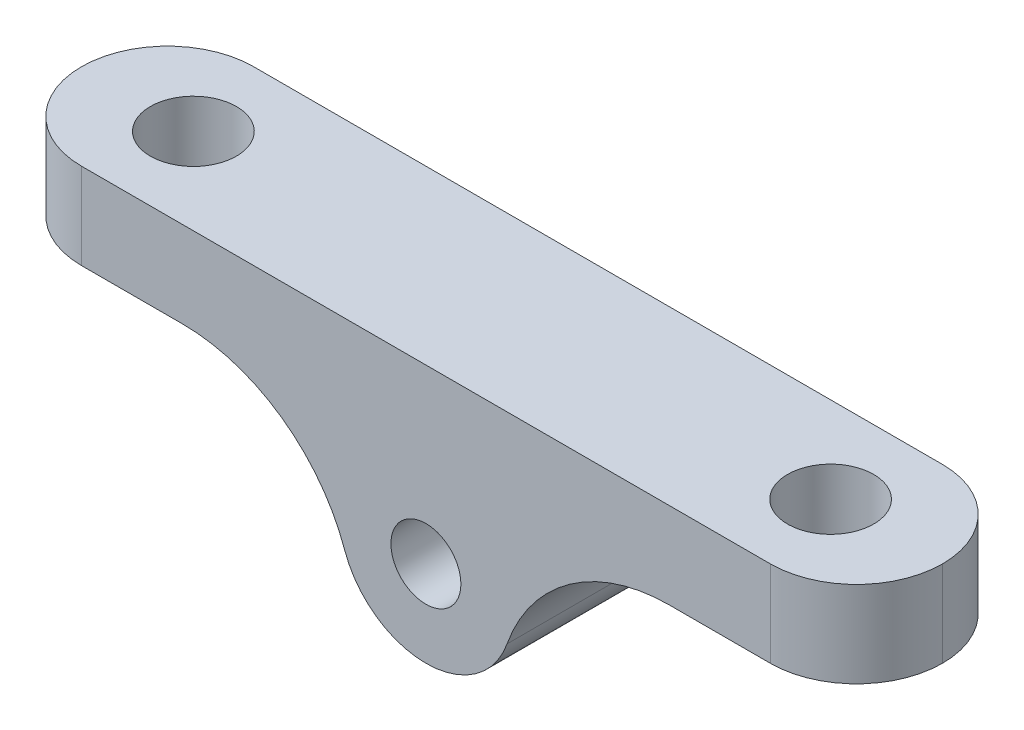
ISO-10303-21;
HEADER;
FILE_DESCRIPTION(('STEP AP214'),'2;1');
FILE_NAME('part.step','',(''),(''),'','','');
FILE_SCHEMA(('AUTOMOTIVE_DESIGN { 1 0 10303 214 1 1 1 1 }'));
ENDSEC;
DATA;
#1=APPLICATION_CONTEXT('core data for automotive mechanical design processes');
#2=APPLICATION_PROTOCOL_DEFINITION('international standard','automotive_design',2000,#1);
#3=PRODUCT_CONTEXT('',#1,'mechanical');
#4=PRODUCT('Part','Part','',(#3));
#5=PRODUCT_RELATED_PRODUCT_CATEGORY('part','',(#4));
#6=PRODUCT_DEFINITION_FORMATION('','',#4);
#7=PRODUCT_DEFINITION_CONTEXT('part definition',#1,'design');
#8=PRODUCT_DEFINITION('design','',#6,#7);
#9=PRODUCT_DEFINITION_SHAPE('','',#8);
#10=(LENGTH_UNIT() NAMED_UNIT(*) SI_UNIT(.MILLI.,.METRE.));
#11=(NAMED_UNIT(*) PLANE_ANGLE_UNIT() SI_UNIT($,.RADIAN.));
#12=(NAMED_UNIT(*) SI_UNIT($,.STERADIAN.) SOLID_ANGLE_UNIT());
#13=UNCERTAINTY_MEASURE_WITH_UNIT(LENGTH_MEASURE(1.E-05),#10,'distance_accuracy_value','');
#14=(GEOMETRIC_REPRESENTATION_CONTEXT(3) GLOBAL_UNCERTAINTY_ASSIGNED_CONTEXT((#13)) GLOBAL_UNIT_ASSIGNED_CONTEXT((#10,
#11,#12)) REPRESENTATION_CONTEXT('',''));
#15=CARTESIAN_POINT('',(0.,0.,0.));
#16=DIRECTION('',(0.,0.,1.));
#17=DIRECTION('',(1.,0.,0.));
#18=AXIS2_PLACEMENT_3D('',#15,#16,#17);
#19=CARTESIAN_POINT('',(63.5,-6.34999999999999,12.7));
#20=DIRECTION('',(0.,-1.,0.));
#21=DIRECTION('',(1.,0.,0.));
#22=AXIS2_PLACEMENT_3D('',#19,#20,#21);
#23=PLANE('',#22);
#24=CARTESIAN_POINT('',(8.25499999999998,-6.35,6.35));
#25=DIRECTION('',(0.,-1.,0.));
#26=DIRECTION('',(1.,0.,0.));
#27=AXIS2_PLACEMENT_3D('',#24,#25,#26);
#28=CIRCLE('',#27,3.175);
#29=CARTESIAN_POINT('',(11.43,-6.35,6.35));
#30=VERTEX_POINT('',#29);
#31=EDGE_CURVE('E230',#30,#30,#28,.T.);
#32=ORIENTED_EDGE('',*,*,#31,.F.);
#33=EDGE_LOOP('',(#32));
#34=FACE_BOUND('',#33,.T.);
#35=DIRECTION('',(-1.,0.,0.));
#36=VECTOR('',#35,1.);
#37=CARTESIAN_POINT('',(63.5,-6.34999999999999,0.));
#38=LINE('',#37,#36);
#39=CARTESIAN_POINT('',(13.7894877578617,-6.35,0.));
#40=VERTEX_POINT('',#39);
#41=CARTESIAN_POINT('',(6.35,-6.35,0.));
#42=VERTEX_POINT('',#41);
#43=EDGE_CURVE('E145',#40,#42,#38,.T.);
#44=ORIENTED_EDGE('',*,*,#43,.F.);
#45=DIRECTION('',(0.,0.,-1.));
#46=VECTOR('',#45,1.);
#47=CARTESIAN_POINT('',(13.7894877578617,-6.35,12.7));
#48=LINE('',#47,#46);
#49=CARTESIAN_POINT('',(13.7894877578617,-6.35,12.7));
#50=VERTEX_POINT('',#49);
#51=EDGE_CURVE('E201',#40,#50,#48,.F.);
#52=ORIENTED_EDGE('',*,*,#51,.T.);
#53=DIRECTION('',(-1.,0.,0.));
#54=VECTOR('',#53,1.);
#55=CARTESIAN_POINT('',(63.5,-6.34999999999999,12.7));
#56=LINE('',#55,#54);
#57=CARTESIAN_POINT('',(6.35,-6.35,12.7));
#58=VERTEX_POINT('',#57);
#59=EDGE_CURVE('E218',#50,#58,#56,.T.);
#60=ORIENTED_EDGE('',*,*,#59,.T.);
#61=CARTESIAN_POINT('',(6.35,-6.35,6.35));
#62=DIRECTION('',(0.,-1.,0.));
#63=DIRECTION('',(1.,0.,0.));
#64=AXIS2_PLACEMENT_3D('',#61,#62,#63);
#65=CIRCLE('',#64,6.35);
#66=CARTESIAN_POINT('',(0.,-6.35,6.35));
#67=VERTEX_POINT('',#66);
#68=EDGE_CURVE('E160',#58,#67,#65,.T.);
#69=ORIENTED_EDGE('',*,*,#68,.T.);
#70=CARTESIAN_POINT('',(6.35,-6.35,6.35));
#71=DIRECTION('',(0.,-1.,0.));
#72=DIRECTION('',(1.,0.,0.));
#73=AXIS2_PLACEMENT_3D('',#70,#71,#72);
#74=CIRCLE('',#73,6.35);
#75=EDGE_CURVE('E153',#67,#42,#74,.T.);
#76=ORIENTED_EDGE('',*,*,#75,.T.);
#77=EDGE_LOOP('',(#44,#52,#60,#69,#76));
#78=FACE_BOUND('',#77,.T.);
#79=ADVANCED_FACE('F43',(#34,#78),#23,.T.);
#80=CARTESIAN_POINT('',(0.,0.,12.7));
#81=DIRECTION('',(0.,1.,0.));
#82=DIRECTION('',(-1.,0.,0.));
#83=AXIS2_PLACEMENT_3D('',#80,#81,#82);
#84=PLANE('',#83);
#85=CARTESIAN_POINT('',(8.255,0.,6.35));
#86=DIRECTION('',(0.,1.,0.));
#87=DIRECTION('',(-1.,0.,0.));
#88=AXIS2_PLACEMENT_3D('',#85,#86,#87);
#89=CIRCLE('',#88,3.175);
#90=CARTESIAN_POINT('',(5.08,0.,6.35));
#91=VERTEX_POINT('',#90);
#92=EDGE_CURVE('E243',#91,#91,#89,.T.);
#93=ORIENTED_EDGE('',*,*,#92,.F.);
#94=EDGE_LOOP('',(#93));
#95=FACE_BOUND('',#94,.T.);
#96=CARTESIAN_POINT('',(55.245,-1.92081199430886E-13,6.35));
#97=DIRECTION('',(0.,1.,0.));
#98=DIRECTION('',(-1.,0.,0.));
#99=AXIS2_PLACEMENT_3D('',#96,#97,#98);
#100=CIRCLE('',#99,3.175);
#101=CARTESIAN_POINT('',(52.07,-1.81042050038307E-13,6.35));
#102=VERTEX_POINT('',#101);
#103=EDGE_CURVE('E187',#102,#102,#100,.T.);
#104=ORIENTED_EDGE('',*,*,#103,.F.);
#105=EDGE_LOOP('',(#104));
#106=FACE_BOUND('',#105,.T.);
#107=DIRECTION('',(1.,0.,0.));
#108=VECTOR('',#107,1.);
#109=CARTESIAN_POINT('',(0.,0.,12.7));
#110=LINE('',#109,#108);
#111=CARTESIAN_POINT('',(6.35,0.,12.7));
#112=VERTEX_POINT('',#111);
#113=CARTESIAN_POINT('',(57.15,0.,12.7));
#114=VERTEX_POINT('',#113);
#115=EDGE_CURVE('E237',#112,#114,#110,.T.);
#116=ORIENTED_EDGE('',*,*,#115,.T.);
#117=CARTESIAN_POINT('',(57.15,0.,6.35));
#118=DIRECTION('',(0.,1.,0.));
#119=DIRECTION('',(-1.,0.,0.));
#120=AXIS2_PLACEMENT_3D('',#117,#118,#119);
#121=CIRCLE('',#120,6.35);
#122=CARTESIAN_POINT('',(63.5,0.,6.35));
#123=VERTEX_POINT('',#122);
#124=EDGE_CURVE('E180',#114,#123,#121,.T.);
#125=ORIENTED_EDGE('',*,*,#124,.T.);
#126=CARTESIAN_POINT('',(57.15,0.,6.35));
#127=DIRECTION('',(0.,1.,0.));
#128=DIRECTION('',(-1.,0.,0.));
#129=AXIS2_PLACEMENT_3D('',#126,#127,#128);
#130=CIRCLE('',#129,6.35);
#131=CARTESIAN_POINT('',(57.15,0.,0.));
#132=VERTEX_POINT('',#131);
#133=EDGE_CURVE('E177',#123,#132,#130,.T.);
#134=ORIENTED_EDGE('',*,*,#133,.T.);
#135=DIRECTION('',(1.,0.,0.));
#136=VECTOR('',#135,1.);
#137=CARTESIAN_POINT('',(0.,0.,0.));
#138=LINE('',#137,#136);
#139=CARTESIAN_POINT('',(6.35,0.,0.));
#140=VERTEX_POINT('',#139);
#141=EDGE_CURVE('E128',#140,#132,#138,.T.);
#142=ORIENTED_EDGE('',*,*,#141,.F.);
#143=CARTESIAN_POINT('',(6.35,0.,6.35));
#144=DIRECTION('',(0.,1.,0.));
#145=DIRECTION('',(-1.,0.,0.));
#146=AXIS2_PLACEMENT_3D('',#143,#144,#145);
#147=CIRCLE('',#146,6.35);
#148=CARTESIAN_POINT('',(0.,0.,6.35));
#149=VERTEX_POINT('',#148);
#150=EDGE_CURVE('E174',#140,#149,#147,.T.);
#151=ORIENTED_EDGE('',*,*,#150,.T.);
#152=CARTESIAN_POINT('',(6.35,0.,6.35));
#153=DIRECTION('',(0.,1.,0.));
#154=DIRECTION('',(-1.,0.,0.));
#155=AXIS2_PLACEMENT_3D('',#152,#153,#154);
#156=CIRCLE('',#155,6.35);
#157=EDGE_CURVE('E171',#149,#112,#156,.T.);
#158=ORIENTED_EDGE('',*,*,#157,.T.);
#159=EDGE_LOOP('',(#116,#125,#134,#142,#151,#158));
#160=FACE_BOUND('',#159,.T.);
#161=ADVANCED_FACE('F274',(#95,#106,#160),#84,.T.);
#162=CARTESIAN_POINT('',(57.15,-6.34999999999999,12.7));
#163=VERTEX_POINT('',#162);
#164=CARTESIAN_POINT('',(49.7105122421383,-6.34999999999999,12.7));
#165=VERTEX_POINT('',#164);
#166=EDGE_CURVE('E249',#163,#165,#56,.T.);
#167=ORIENTED_EDGE('',*,*,#166,.T.);
#168=DIRECTION('',(0.,0.,-1.));
#169=VECTOR('',#168,1.);
#170=CARTESIAN_POINT('',(49.7105122421383,-6.34999999999999,0.));
#171=LINE('',#170,#169);
#172=CARTESIAN_POINT('',(49.7105122421383,-6.34999999999999,0.));
#173=VERTEX_POINT('',#172);
#174=EDGE_CURVE('E143',#165,#173,#171,.T.);
#175=ORIENTED_EDGE('',*,*,#174,.T.);
#176=CARTESIAN_POINT('',(57.15,-6.34999999999999,0.));
#177=VERTEX_POINT('',#176);
#178=EDGE_CURVE('E124',#177,#173,#38,.T.);
#179=ORIENTED_EDGE('',*,*,#178,.F.);
#180=CARTESIAN_POINT('',(57.15,-6.34999999999999,6.35));
#181=DIRECTION('',(0.,-1.,0.));
#182=DIRECTION('',(1.,0.,0.));
#183=AXIS2_PLACEMENT_3D('',#180,#181,#182);
#184=CIRCLE('',#183,6.35);
#185=CARTESIAN_POINT('',(63.5,-6.34999999999999,6.35));
#186=VERTEX_POINT('',#185);
#187=EDGE_CURVE('E140',#177,#186,#184,.T.);
#188=ORIENTED_EDGE('',*,*,#187,.T.);
#189=CARTESIAN_POINT('',(57.15,-6.34999999999999,6.35));
#190=DIRECTION('',(0.,-1.,0.));
#191=DIRECTION('',(1.,0.,0.));
#192=AXIS2_PLACEMENT_3D('',#189,#190,#191);
#193=CIRCLE('',#192,6.35);
#194=EDGE_CURVE('E152',#186,#163,#193,.T.);
#195=ORIENTED_EDGE('',*,*,#194,.T.);
#196=EDGE_LOOP('',(#167,#175,#179,#188,#195));
#197=FACE_BOUND('',#196,.T.);
#198=CARTESIAN_POINT('',(55.245,-6.34999999999999,6.35));
#199=DIRECTION('',(0.,-1.,0.));
#200=DIRECTION('',(1.,0.,0.));
#201=AXIS2_PLACEMENT_3D('',#198,#199,#200);
#202=CIRCLE('',#201,3.175);
#203=CARTESIAN_POINT('',(58.42,-6.34999999999999,6.35));
#204=VERTEX_POINT('',#203);
#205=EDGE_CURVE('E233',#204,#204,#202,.T.);
#206=ORIENTED_EDGE('',*,*,#205,.F.);
#207=EDGE_LOOP('',(#206));
#208=FACE_BOUND('',#207,.T.);
#209=ADVANCED_FACE('F138',(#197,#208),#23,.T.);
#210=CARTESIAN_POINT('',(0.,0.,12.7));
#211=DIRECTION('',(0.,0.,-1.));
#212=DIRECTION('',(-1.,0.,0.));
#213=AXIS2_PLACEMENT_3D('',#210,#211,#212);
#214=PLANE('',#213);
#215=ORIENTED_EDGE('',*,*,#166,.F.);
#216=DIRECTION('',(0.,-1.,0.));
#217=VECTOR('',#216,1.);
#218=CARTESIAN_POINT('',(57.15,0.,12.7));
#219=LINE('',#218,#217);
#220=EDGE_CURVE('E167',#163,#114,#219,.F.);
#221=ORIENTED_EDGE('',*,*,#220,.T.);
#222=ORIENTED_EDGE('',*,*,#115,.F.);
#223=DIRECTION('',(0.,-1.,0.));
#224=VECTOR('',#223,1.);
#225=CARTESIAN_POINT('',(6.35,0.,12.7));
#226=LINE('',#225,#224);
#227=EDGE_CURVE('E157',#112,#58,#226,.T.);
#228=ORIENTED_EDGE('',*,*,#227,.T.);
#229=ORIENTED_EDGE('',*,*,#59,.F.);
#230=CARTESIAN_POINT('',(13.7894877578617,-19.05,12.7));
#231=DIRECTION('',(0.,0.,-1.));
#232=DIRECTION('',(-1.,0.,0.));
#233=AXIS2_PLACEMENT_3D('',#230,#231,#232);
#234=CIRCLE('',#233,12.7);
#235=CARTESIAN_POINT('',(25.7631625859539,-14.8166666666667,12.7));
#236=VERTEX_POINT('',#235);
#237=EDGE_CURVE('E52',#50,#236,#234,.T.);
#238=ORIENTED_EDGE('',*,*,#237,.T.);
#239=CARTESIAN_POINT('',(31.75,-12.7,12.7));
#240=DIRECTION('',(0.,0.,1.));
#241=DIRECTION('',(1.,0.,0.));
#242=AXIS2_PLACEMENT_3D('',#239,#240,#241);
#243=CIRCLE('',#242,6.35);
#244=CARTESIAN_POINT('',(37.7368374140461,-14.8166666666667,12.7));
#245=VERTEX_POINT('',#244);
#246=EDGE_CURVE('E217',#236,#245,#243,.T.);
#247=ORIENTED_EDGE('',*,*,#246,.T.);
#248=CARTESIAN_POINT('',(49.7105122421383,-19.05,12.7));
#249=DIRECTION('',(0.,0.,-1.));
#250=DIRECTION('',(-1.,0.,0.));
#251=AXIS2_PLACEMENT_3D('',#248,#249,#250);
#252=CIRCLE('',#251,12.7);
#253=EDGE_CURVE('E204',#245,#165,#252,.T.);
#254=ORIENTED_EDGE('',*,*,#253,.T.);
#255=EDGE_LOOP('',(#215,#221,#222,#228,#229,#238,#247,#254));
#256=FACE_BOUND('',#255,.T.);
#257=CARTESIAN_POINT('',(31.75,-12.7,12.7));
#258=DIRECTION('',(0.,0.,1.));
#259=DIRECTION('',(1.,0.,0.));
#260=AXIS2_PLACEMENT_3D('',#257,#258,#259);
#261=CIRCLE('',#260,2.5796875);
#262=CARTESIAN_POINT('',(34.3296875,-12.7,12.7));
#263=VERTEX_POINT('',#262);
#264=EDGE_CURVE('E224',#263,#263,#261,.T.);
#265=ORIENTED_EDGE('',*,*,#264,.F.);
#266=EDGE_LOOP('',(#265));
#267=FACE_BOUND('',#266,.T.);
#268=ADVANCED_FACE('F215',(#256,#267),#214,.F.);
#269=CARTESIAN_POINT('',(0.,0.,0.));
#270=DIRECTION('',(0.,0.,-1.));
#271=DIRECTION('',(-1.,0.,0.));
#272=AXIS2_PLACEMENT_3D('',#269,#270,#271);
#273=PLANE('',#272);
#274=ORIENTED_EDGE('',*,*,#141,.T.);
#275=DIRECTION('',(0.,-1.,0.));
#276=VECTOR('',#275,1.);
#277=CARTESIAN_POINT('',(57.15,0.,0.));
#278=LINE('',#277,#276);
#279=EDGE_CURVE('E120',#132,#177,#278,.T.);
#280=ORIENTED_EDGE('',*,*,#279,.T.);
#281=ORIENTED_EDGE('',*,*,#178,.T.);
#282=CARTESIAN_POINT('',(49.7105122421383,-19.05,0.));
#283=DIRECTION('',(0.,0.,-1.));
#284=DIRECTION('',(-1.,0.,0.));
#285=AXIS2_PLACEMENT_3D('',#282,#283,#284);
#286=CIRCLE('',#285,12.7);
#287=CARTESIAN_POINT('',(37.7368374140461,-14.8166666666667,0.));
#288=VERTEX_POINT('',#287);
#289=EDGE_CURVE('E207',#173,#288,#286,.F.);
#290=ORIENTED_EDGE('',*,*,#289,.T.);
#291=CARTESIAN_POINT('',(31.75,-12.7,0.));
#292=DIRECTION('',(0.,0.,1.));
#293=DIRECTION('',(1.,0.,0.));
#294=AXIS2_PLACEMENT_3D('',#291,#292,#293);
#295=CIRCLE('',#294,6.35);
#296=CARTESIAN_POINT('',(25.7631625859539,-14.8166666666667,0.));
#297=VERTEX_POINT('',#296);
#298=EDGE_CURVE('E263',#297,#288,#295,.T.);
#299=ORIENTED_EDGE('',*,*,#298,.F.);
#300=CARTESIAN_POINT('',(13.7894877578617,-19.05,0.));
#301=DIRECTION('',(0.,0.,-1.));
#302=DIRECTION('',(-1.,0.,0.));
#303=AXIS2_PLACEMENT_3D('',#300,#301,#302);
#304=CIRCLE('',#303,12.7);
#305=EDGE_CURVE('E11',#297,#40,#304,.F.);
#306=ORIENTED_EDGE('',*,*,#305,.T.);
#307=ORIENTED_EDGE('',*,*,#43,.T.);
#308=DIRECTION('',(0.,-1.,0.));
#309=VECTOR('',#308,1.);
#310=CARTESIAN_POINT('',(6.35,0.,0.));
#311=LINE('',#310,#309);
#312=EDGE_CURVE('E134',#42,#140,#311,.F.);
#313=ORIENTED_EDGE('',*,*,#312,.T.);
#314=EDGE_LOOP('',(#274,#280,#281,#290,#299,#306,#307,#313));
#315=FACE_BOUND('',#314,.T.);
#316=CARTESIAN_POINT('',(31.75,-12.7,0.));
#317=DIRECTION('',(0.,0.,1.));
#318=DIRECTION('',(1.,0.,0.));
#319=AXIS2_PLACEMENT_3D('',#316,#317,#318);
#320=CIRCLE('',#319,2.5796875);
#321=CARTESIAN_POINT('',(34.3296875,-12.7,0.));
#322=VERTEX_POINT('',#321);
#323=EDGE_CURVE('E192',#322,#322,#320,.T.);
#324=ORIENTED_EDGE('',*,*,#323,.T.);
#325=EDGE_LOOP('',(#324));
#326=FACE_BOUND('',#325,.T.);
#327=ADVANCED_FACE('F122',(#315,#326),#273,.T.);
#328=CARTESIAN_POINT('',(55.2449999999999,-26.1620000000002,6.35));
#329=DIRECTION('',(0.,1.,0.));
#330=DIRECTION('',(-1.,0.,0.));
#331=AXIS2_PLACEMENT_3D('',#328,#329,#330);
#332=CYLINDRICAL_SURFACE('',#331,3.175);
#333=ORIENTED_EDGE('',*,*,#205,.T.);
#334=EDGE_LOOP('',(#333));
#335=FACE_BOUND('',#334,.T.);
#336=ORIENTED_EDGE('',*,*,#103,.T.);
#337=EDGE_LOOP('',(#336));
#338=FACE_BOUND('',#337,.T.);
#339=ADVANCED_FACE('F309',(#335,#338),#332,.F.);
#340=CARTESIAN_POINT('',(8.25499999999991,-26.162,6.35));
#341=DIRECTION('',(0.,1.,0.));
#342=DIRECTION('',(-1.,0.,0.));
#343=AXIS2_PLACEMENT_3D('',#340,#341,#342);
#344=CYLINDRICAL_SURFACE('',#343,3.175);
#345=ORIENTED_EDGE('',*,*,#31,.T.);
#346=EDGE_LOOP('',(#345));
#347=FACE_BOUND('',#346,.T.);
#348=ORIENTED_EDGE('',*,*,#92,.T.);
#349=EDGE_LOOP('',(#348));
#350=FACE_BOUND('',#349,.T.);
#351=ADVANCED_FACE('F314',(#347,#350),#344,.F.);
#352=CARTESIAN_POINT('',(57.15,0.,6.35));
#353=DIRECTION('',(0.,-1.,0.));
#354=DIRECTION('',(0.,0.,-1.));
#355=AXIS2_PLACEMENT_3D('',#352,#353,#354);
#356=CYLINDRICAL_SURFACE('',#355,6.35);
#357=ORIENTED_EDGE('',*,*,#279,.F.);
#358=ORIENTED_EDGE('',*,*,#133,.F.);
#359=DIRECTION('',(0.,-1.,0.));
#360=VECTOR('',#359,1.);
#361=CARTESIAN_POINT('',(63.5,0.,6.35));
#362=LINE('',#361,#360);
#363=EDGE_CURVE('E149',#186,#123,#362,.F.);
#364=ORIENTED_EDGE('',*,*,#363,.F.);
#365=ORIENTED_EDGE('',*,*,#187,.F.);
#366=EDGE_LOOP('',(#357,#358,#364,#365));
#367=FACE_BOUND('',#366,.T.);
#368=ADVANCED_FACE('F147',(#367),#356,.T.);
#369=CARTESIAN_POINT('',(57.15,0.,6.35));
#370=DIRECTION('',(0.,1.,0.));
#371=DIRECTION('',(0.,0.,1.));
#372=AXIS2_PLACEMENT_3D('',#369,#370,#371);
#373=CYLINDRICAL_SURFACE('',#372,6.35);
#374=ORIENTED_EDGE('',*,*,#124,.F.);
#375=ORIENTED_EDGE('',*,*,#220,.F.);
#376=ORIENTED_EDGE('',*,*,#194,.F.);
#377=ORIENTED_EDGE('',*,*,#363,.T.);
#378=EDGE_LOOP('',(#374,#375,#376,#377));
#379=FACE_BOUND('',#378,.T.);
#380=ADVANCED_FACE('F273',(#379),#373,.T.);
#381=CARTESIAN_POINT('',(6.35,0.,6.35));
#382=DIRECTION('',(0.,-1.,0.));
#383=DIRECTION('',(1.,0.,0.));
#384=AXIS2_PLACEMENT_3D('',#381,#382,#383);
#385=CYLINDRICAL_SURFACE('',#384,6.35);
#386=ORIENTED_EDGE('',*,*,#227,.F.);
#387=ORIENTED_EDGE('',*,*,#157,.F.);
#388=DIRECTION('',(0.,-1.,0.));
#389=VECTOR('',#388,1.);
#390=CARTESIAN_POINT('',(0.,0.,6.35));
#391=LINE('',#390,#389);
#392=EDGE_CURVE('E188',#67,#149,#391,.F.);
#393=ORIENTED_EDGE('',*,*,#392,.F.);
#394=ORIENTED_EDGE('',*,*,#68,.F.);
#395=EDGE_LOOP('',(#386,#387,#393,#394));
#396=FACE_BOUND('',#395,.T.);
#397=ADVANCED_FACE('F279',(#396),#385,.T.);
#398=CARTESIAN_POINT('',(6.35,0.,6.35));
#399=DIRECTION('',(0.,1.,0.));
#400=DIRECTION('',(-1.,0.,0.));
#401=AXIS2_PLACEMENT_3D('',#398,#399,#400);
#402=CYLINDRICAL_SURFACE('',#401,6.35);
#403=ORIENTED_EDGE('',*,*,#150,.F.);
#404=ORIENTED_EDGE('',*,*,#312,.F.);
#405=ORIENTED_EDGE('',*,*,#75,.F.);
#406=ORIENTED_EDGE('',*,*,#392,.T.);
#407=EDGE_LOOP('',(#403,#404,#405,#406));
#408=FACE_BOUND('',#407,.T.);
#409=ADVANCED_FACE('F280',(#408),#402,.T.);
#410=CARTESIAN_POINT('',(31.75,-12.7,0.));
#411=DIRECTION('',(0.,0.,1.));
#412=DIRECTION('',(1.,0.,0.));
#413=AXIS2_PLACEMENT_3D('',#410,#411,#412);
#414=CYLINDRICAL_SURFACE('',#413,6.35);
#415=ORIENTED_EDGE('',*,*,#298,.T.);
#416=DIRECTION('',(0.,0.,1.));
#417=VECTOR('',#416,1.);
#418=CARTESIAN_POINT('',(37.7368374140461,-14.8166666666667,0.));
#419=LINE('',#418,#417);
#420=EDGE_CURVE('E195',#288,#245,#419,.T.);
#421=ORIENTED_EDGE('',*,*,#420,.T.);
#422=ORIENTED_EDGE('',*,*,#246,.F.);
#423=DIRECTION('',(0.,0.,1.));
#424=VECTOR('',#423,1.);
#425=CARTESIAN_POINT('',(25.7631625859539,-14.8166666666667,0.));
#426=LINE('',#425,#424);
#427=EDGE_CURVE('E133',#236,#297,#426,.F.);
#428=ORIENTED_EDGE('',*,*,#427,.T.);
#429=EDGE_LOOP('',(#415,#421,#422,#428));
#430=FACE_BOUND('',#429,.T.);
#431=ADVANCED_FACE('F221',(#430),#414,.T.);
#432=CARTESIAN_POINT('',(31.75,-12.7,0.));
#433=DIRECTION('',(0.,0.,1.));
#434=DIRECTION('',(1.,0.,0.));
#435=AXIS2_PLACEMENT_3D('',#432,#433,#434);
#436=CYLINDRICAL_SURFACE('',#435,2.5796875);
#437=ORIENTED_EDGE('',*,*,#323,.F.);
#438=EDGE_LOOP('',(#437));
#439=FACE_BOUND('',#438,.T.);
#440=ORIENTED_EDGE('',*,*,#264,.T.);
#441=EDGE_LOOP('',(#440));
#442=FACE_BOUND('',#441,.T.);
#443=ADVANCED_FACE('F287',(#439,#442),#436,.F.);
#444=CARTESIAN_POINT('',(49.7105122421383,-19.05,0.));
#445=DIRECTION('',(0.,0.,1.));
#446=DIRECTION('',(1.,0.,0.));
#447=AXIS2_PLACEMENT_3D('',#444,#445,#446);
#448=CYLINDRICAL_SURFACE('',#447,12.7);
#449=ORIENTED_EDGE('',*,*,#289,.F.);
#450=ORIENTED_EDGE('',*,*,#174,.F.);
#451=ORIENTED_EDGE('',*,*,#253,.F.);
#452=ORIENTED_EDGE('',*,*,#420,.F.);
#453=EDGE_LOOP('',(#449,#450,#451,#452));
#454=FACE_BOUND('',#453,.T.);
#455=ADVANCED_FACE('F270',(#454),#448,.F.);
#456=CARTESIAN_POINT('',(13.7894877578617,-19.05,0.));
#457=DIRECTION('',(0.,0.,1.));
#458=DIRECTION('',(1.,0.,0.));
#459=AXIS2_PLACEMENT_3D('',#456,#457,#458);
#460=CYLINDRICAL_SURFACE('',#459,12.7);
#461=ORIENTED_EDGE('',*,*,#305,.F.);
#462=ORIENTED_EDGE('',*,*,#427,.F.);
#463=ORIENTED_EDGE('',*,*,#237,.F.);
#464=ORIENTED_EDGE('',*,*,#51,.F.);
#465=EDGE_LOOP('',(#461,#462,#463,#464));
#466=FACE_BOUND('',#465,.T.);
#467=ADVANCED_FACE('F45',(#466),#460,.F.);
#468=CLOSED_SHELL('',(#79,#161,#209,#268,#327,#339,#351,#368,#380,#397,#409,#431,#443,#455,#467));
#469=MANIFOLD_SOLID_BREP('B2',#468);
#470=ADVANCED_BREP_SHAPE_REPRESENTATION('',(#18,#469),#14);
#471=SHAPE_DEFINITION_REPRESENTATION(#9,#470);
ENDSEC;
END-ISO-10303-21;
